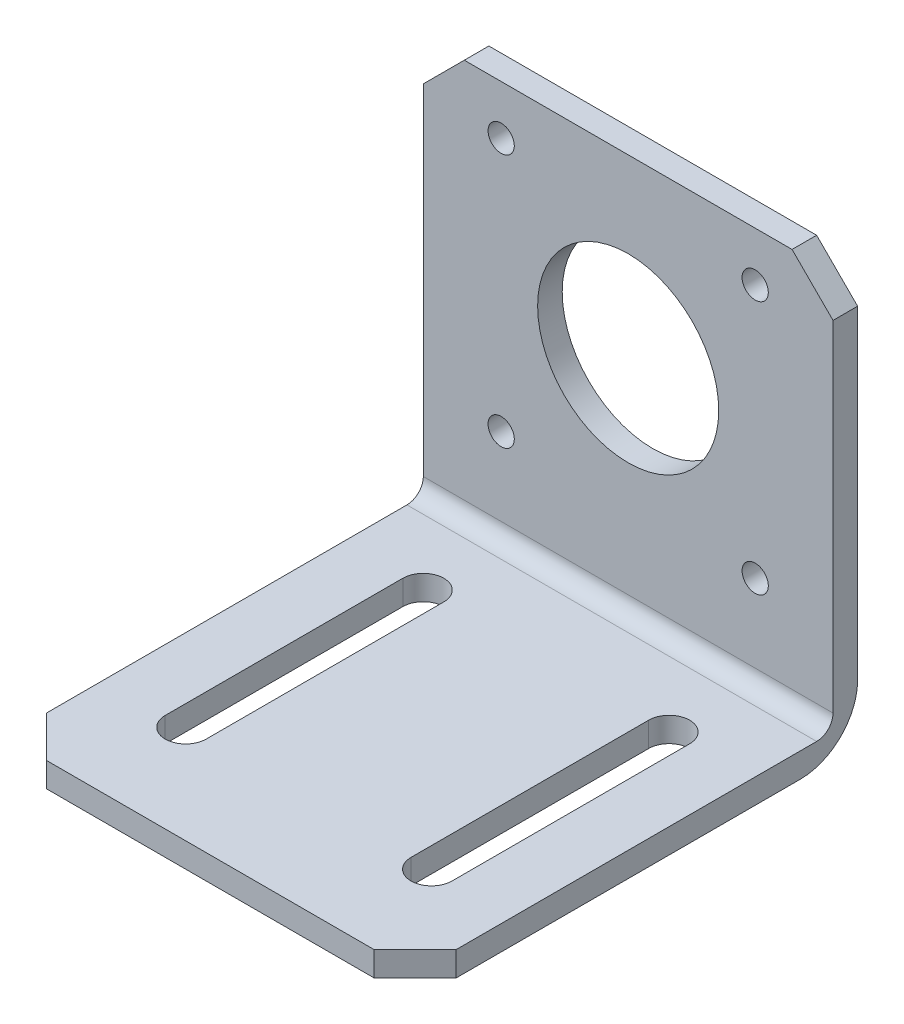
ISO-10303-21;
HEADER;
FILE_DESCRIPTION(('STEP AP214'),'2;1');
FILE_NAME('part.step','',(''),(''),'','','');
FILE_SCHEMA(('AUTOMOTIVE_DESIGN { 1 0 10303 214 1 1 1 1 }'));
ENDSEC;
DATA;
#1=APPLICATION_CONTEXT('core data for automotive mechanical design processes');
#2=APPLICATION_PROTOCOL_DEFINITION('international standard','automotive_design',2000,#1);
#3=PRODUCT_CONTEXT('',#1,'mechanical');
#4=PRODUCT('Part','Part','',(#3));
#5=PRODUCT_RELATED_PRODUCT_CATEGORY('part','',(#4));
#6=PRODUCT_DEFINITION_FORMATION('','',#4);
#7=PRODUCT_DEFINITION_CONTEXT('part definition',#1,'design');
#8=PRODUCT_DEFINITION('design','',#6,#7);
#9=PRODUCT_DEFINITION_SHAPE('','',#8);
#10=(LENGTH_UNIT() NAMED_UNIT(*) SI_UNIT(.MILLI.,.METRE.));
#11=(NAMED_UNIT(*) PLANE_ANGLE_UNIT() SI_UNIT($,.RADIAN.));
#12=(NAMED_UNIT(*) SI_UNIT($,.STERADIAN.) SOLID_ANGLE_UNIT());
#13=UNCERTAINTY_MEASURE_WITH_UNIT(LENGTH_MEASURE(1.E-05),#10,'distance_accuracy_value','');
#14=(GEOMETRIC_REPRESENTATION_CONTEXT(3) GLOBAL_UNCERTAINTY_ASSIGNED_CONTEXT((#13)) GLOBAL_UNIT_ASSIGNED_CONTEXT((#10,
#11,#12)) REPRESENTATION_CONTEXT('',''));
#15=CARTESIAN_POINT('',(0.,0.,0.));
#16=DIRECTION('',(0.,0.,1.));
#17=DIRECTION('',(1.,0.,0.));
#18=AXIS2_PLACEMENT_3D('',#15,#16,#17);
#19=CARTESIAN_POINT('',(0.,0.,3.));
#20=DIRECTION('',(0.,0.,-1.));
#21=DIRECTION('',(-1.,0.,0.));
#22=AXIS2_PLACEMENT_3D('',#19,#20,#21);
#23=PLANE('',#22);
#24=CARTESIAN_POINT('',(40.5,14.5,3.));
#25=DIRECTION('',(0.,0.,-1.));
#26=DIRECTION('',(-1.,0.,0.));
#27=AXIS2_PLACEMENT_3D('',#24,#25,#26);
#28=CIRCLE('',#27,1.6);
#29=CARTESIAN_POINT('',(38.9,14.5,3.));
#30=VERTEX_POINT('',#29);
#31=EDGE_CURVE('E272',#30,#30,#28,.T.);
#32=ORIENTED_EDGE('',*,*,#31,.T.);
#33=EDGE_LOOP('',(#32));
#34=FACE_BOUND('',#33,.T.);
#35=CARTESIAN_POINT('',(9.5,14.5,3.));
#36=DIRECTION('',(0.,0.,-1.));
#37=DIRECTION('',(-1.,0.,0.));
#38=AXIS2_PLACEMENT_3D('',#35,#36,#37);
#39=CIRCLE('',#38,1.6);
#40=CARTESIAN_POINT('',(7.9,14.5,3.));
#41=VERTEX_POINT('',#40);
#42=EDGE_CURVE('E269',#41,#41,#39,.T.);
#43=ORIENTED_EDGE('',*,*,#42,.T.);
#44=EDGE_LOOP('',(#43));
#45=FACE_BOUND('',#44,.T.);
#46=CARTESIAN_POINT('',(9.50000000000001,45.5,3.));
#47=DIRECTION('',(0.,0.,-1.));
#48=DIRECTION('',(-1.,0.,0.));
#49=AXIS2_PLACEMENT_3D('',#46,#47,#48);
#50=CIRCLE('',#49,1.6);
#51=CARTESIAN_POINT('',(7.90000000000001,45.5,3.));
#52=VERTEX_POINT('',#51);
#53=EDGE_CURVE('E266',#52,#52,#50,.T.);
#54=ORIENTED_EDGE('',*,*,#53,.T.);
#55=EDGE_LOOP('',(#54));
#56=FACE_BOUND('',#55,.T.);
#57=CARTESIAN_POINT('',(40.5,45.5,3.));
#58=DIRECTION('',(0.,0.,-1.));
#59=DIRECTION('',(-1.,0.,0.));
#60=AXIS2_PLACEMENT_3D('',#57,#58,#59);
#61=CIRCLE('',#60,1.6);
#62=CARTESIAN_POINT('',(38.9,45.5,3.));
#63=VERTEX_POINT('',#62);
#64=EDGE_CURVE('E263',#63,#63,#61,.T.);
#65=ORIENTED_EDGE('',*,*,#64,.T.);
#66=EDGE_LOOP('',(#65));
#67=FACE_BOUND('',#66,.T.);
#68=CARTESIAN_POINT('',(25.,30.,3.));
#69=DIRECTION('',(0.,0.,-1.));
#70=DIRECTION('',(-1.,0.,0.));
#71=AXIS2_PLACEMENT_3D('',#68,#69,#70);
#72=CIRCLE('',#71,11.05);
#73=CARTESIAN_POINT('',(13.95,30.,3.));
#74=VERTEX_POINT('',#73);
#75=EDGE_CURVE('E260',#74,#74,#72,.T.);
#76=ORIENTED_EDGE('',*,*,#75,.T.);
#77=EDGE_LOOP('',(#76));
#78=FACE_BOUND('',#77,.T.);
#79=DIRECTION('',(0.,-1.,0.));
#80=VECTOR('',#79,1.);
#81=CARTESIAN_POINT('',(0.,0.,3.));
#82=LINE('',#81,#80);
#83=CARTESIAN_POINT('',(0.,46.5,3.));
#84=VERTEX_POINT('',#83);
#85=CARTESIAN_POINT('',(0.,5.,3.));
#86=VERTEX_POINT('',#85);
#87=EDGE_CURVE('E287',#84,#86,#82,.T.);
#88=ORIENTED_EDGE('',*,*,#87,.T.);
#89=DIRECTION('',(-1.,0.,0.));
#90=VECTOR('',#89,1.);
#91=CARTESIAN_POINT('',(50.,5.,3.));
#92=LINE('',#91,#90);
#93=CARTESIAN_POINT('',(50.,5.,3.));
#94=VERTEX_POINT('',#93);
#95=EDGE_CURVE('E49',#86,#94,#92,.F.);
#96=ORIENTED_EDGE('',*,*,#95,.T.);
#97=DIRECTION('',(0.,1.,0.));
#98=VECTOR('',#97,1.);
#99=CARTESIAN_POINT('',(50.,0.,3.));
#100=LINE('',#99,#98);
#101=CARTESIAN_POINT('',(50.,46.5,3.));
#102=VERTEX_POINT('',#101);
#103=EDGE_CURVE('E289',#94,#102,#100,.T.);
#104=ORIENTED_EDGE('',*,*,#103,.T.);
#105=DIRECTION('',(0.707106781186549,-0.707106781186547,0.));
#106=VECTOR('',#105,1.);
#107=CARTESIAN_POINT('',(45.,51.5,3.));
#108=LINE('',#107,#106);
#109=CARTESIAN_POINT('',(45.,51.5,3.));
#110=VERTEX_POINT('',#109);
#111=EDGE_CURVE('E341',#102,#110,#108,.F.);
#112=ORIENTED_EDGE('',*,*,#111,.T.);
#113=DIRECTION('',(-1.,0.,0.));
#114=VECTOR('',#113,1.);
#115=CARTESIAN_POINT('',(0.,51.5,3.));
#116=LINE('',#115,#114);
#117=CARTESIAN_POINT('',(5.,51.5,3.));
#118=VERTEX_POINT('',#117);
#119=EDGE_CURVE('E292',#110,#118,#116,.T.);
#120=ORIENTED_EDGE('',*,*,#119,.T.);
#121=DIRECTION('',(0.707106781186547,0.707106781186549,0.));
#122=VECTOR('',#121,1.);
#123=CARTESIAN_POINT('',(0.,46.5,3.));
#124=LINE('',#123,#122);
#125=EDGE_CURVE('E343',#118,#84,#124,.F.);
#126=ORIENTED_EDGE('',*,*,#125,.T.);
#127=EDGE_LOOP('',(#88,#96,#104,#112,#120,#126));
#128=FACE_BOUND('',#127,.T.);
#129=ADVANCED_FACE('F34',(#34,#45,#56,#67,#78,#128),#23,.F.);
#130=CARTESIAN_POINT('',(0.,0.,3.));
#131=DIRECTION('',(1.,0.,0.));
#132=DIRECTION('',(0.,1.,0.));
#133=AXIS2_PLACEMENT_3D('',#130,#131,#132);
#134=PLANE('',#133);
#135=DIRECTION('',(0.,-1.,0.));
#136=VECTOR('',#135,1.);
#137=CARTESIAN_POINT('',(0.,0.,0.));
#138=LINE('',#137,#136);
#139=CARTESIAN_POINT('',(0.,46.5,0.));
#140=VERTEX_POINT('',#139);
#141=CARTESIAN_POINT('',(0.,7.,0.));
#142=VERTEX_POINT('',#141);
#143=EDGE_CURVE('E286',#140,#142,#138,.T.);
#144=ORIENTED_EDGE('',*,*,#143,.T.);
#145=CARTESIAN_POINT('',(0.,7.,7.));
#146=DIRECTION('',(1.,0.,0.));
#147=DIRECTION('',(0.,1.,0.));
#148=AXIS2_PLACEMENT_3D('',#145,#146,#147);
#149=CIRCLE('',#148,7.);
#150=CARTESIAN_POINT('',(0.,0.,7.));
#151=VERTEX_POINT('',#150);
#152=EDGE_CURVE('E352',#142,#151,#149,.F.);
#153=ORIENTED_EDGE('',*,*,#152,.T.);
#154=DIRECTION('',(0.,0.,-1.));
#155=VECTOR('',#154,1.);
#156=CARTESIAN_POINT('',(0.,0.,3.));
#157=LINE('',#156,#155);
#158=CARTESIAN_POINT('',(0.,0.,49.));
#159=VERTEX_POINT('',#158);
#160=EDGE_CURVE('E304',#159,#151,#157,.T.);
#161=ORIENTED_EDGE('',*,*,#160,.F.);
#162=DIRECTION('',(0.,1.,0.));
#163=VECTOR('',#162,1.);
#164=CARTESIAN_POINT('',(0.,0.,49.));
#165=LINE('',#164,#163);
#166=CARTESIAN_POINT('',(0.,3.,49.));
#167=VERTEX_POINT('',#166);
#168=EDGE_CURVE('E320',#159,#167,#165,.T.);
#169=ORIENTED_EDGE('',*,*,#168,.T.);
#170=DIRECTION('',(0.,0.,-1.));
#171=VECTOR('',#170,1.);
#172=CARTESIAN_POINT('',(0.,3.,54.));
#173=LINE('',#172,#171);
#174=CARTESIAN_POINT('',(0.,3.,5.));
#175=VERTEX_POINT('',#174);
#176=EDGE_CURVE('E281',#167,#175,#173,.T.);
#177=ORIENTED_EDGE('',*,*,#176,.T.);
#178=CARTESIAN_POINT('',(0.,5.,5.));
#179=DIRECTION('',(1.,0.,0.));
#180=DIRECTION('',(0.,1.,0.));
#181=AXIS2_PLACEMENT_3D('',#178,#179,#180);
#182=CIRCLE('',#181,2.);
#183=EDGE_CURVE('E42',#175,#86,#182,.T.);
#184=ORIENTED_EDGE('',*,*,#183,.T.);
#185=ORIENTED_EDGE('',*,*,#87,.F.);
#186=DIRECTION('',(0.,0.,-1.));
#187=VECTOR('',#186,1.);
#188=CARTESIAN_POINT('',(0.,46.5,3.));
#189=LINE('',#188,#187);
#190=EDGE_CURVE('E317',#84,#140,#189,.T.);
#191=ORIENTED_EDGE('',*,*,#190,.T.);
#192=EDGE_LOOP('',(#144,#153,#161,#169,#177,#184,#185,#191));
#193=FACE_BOUND('',#192,.T.);
#194=ADVANCED_FACE('F365',(#193),#134,.F.);
#195=CARTESIAN_POINT('',(0.,0.,3.));
#196=DIRECTION('',(0.,1.,0.));
#197=DIRECTION('',(0.,0.,1.));
#198=AXIS2_PLACEMENT_3D('',#195,#196,#197);
#199=PLANE('',#198);
#200=DIRECTION('',(0.,0.,-1.));
#201=VECTOR('',#200,1.);
#202=CARTESIAN_POINT('',(12.5,0.,13.));
#203=LINE('',#202,#201);
#204=CARTESIAN_POINT('',(12.5,0.,42.));
#205=VERTEX_POINT('',#204);
#206=CARTESIAN_POINT('',(12.5,0.,13.));
#207=VERTEX_POINT('',#206);
#208=EDGE_CURVE('E182',#205,#207,#203,.T.);
#209=ORIENTED_EDGE('',*,*,#208,.T.);
#210=CARTESIAN_POINT('',(10.,0.,13.));
#211=DIRECTION('',(0.,1.,0.));
#212=DIRECTION('',(0.,0.,1.));
#213=AXIS2_PLACEMENT_3D('',#210,#211,#212);
#214=CIRCLE('',#213,2.5);
#215=CARTESIAN_POINT('',(7.5,0.,13.));
#216=VERTEX_POINT('',#215);
#217=EDGE_CURVE('E174',#207,#216,#214,.T.);
#218=ORIENTED_EDGE('',*,*,#217,.T.);
#219=DIRECTION('',(0.,0.,1.));
#220=VECTOR('',#219,1.);
#221=CARTESIAN_POINT('',(7.5,0.,13.));
#222=LINE('',#221,#220);
#223=CARTESIAN_POINT('',(7.5,0.,42.));
#224=VERTEX_POINT('',#223);
#225=EDGE_CURVE('E186',#216,#224,#222,.T.);
#226=ORIENTED_EDGE('',*,*,#225,.T.);
#227=CARTESIAN_POINT('',(10.,0.,42.));
#228=DIRECTION('',(0.,1.,0.));
#229=DIRECTION('',(0.,0.,1.));
#230=AXIS2_PLACEMENT_3D('',#227,#228,#229);
#231=CIRCLE('',#230,2.5);
#232=EDGE_CURVE('E190',#224,#205,#231,.T.);
#233=ORIENTED_EDGE('',*,*,#232,.T.);
#234=EDGE_LOOP('',(#209,#218,#226,#233));
#235=FACE_BOUND('',#234,.T.);
#236=DIRECTION('',(0.,0.,1.));
#237=VECTOR('',#236,1.);
#238=CARTESIAN_POINT('',(37.5,0.,42.));
#239=LINE('',#238,#237);
#240=CARTESIAN_POINT('',(37.5,0.,13.));
#241=VERTEX_POINT('',#240);
#242=CARTESIAN_POINT('',(37.5,0.,42.));
#243=VERTEX_POINT('',#242);
#244=EDGE_CURVE('E225',#241,#243,#239,.T.);
#245=ORIENTED_EDGE('',*,*,#244,.T.);
#246=CARTESIAN_POINT('',(40.,0.,42.));
#247=DIRECTION('',(0.,1.,0.));
#248=DIRECTION('',(0.,0.,1.));
#249=AXIS2_PLACEMENT_3D('',#246,#247,#248);
#250=CIRCLE('',#249,2.5);
#251=CARTESIAN_POINT('',(42.5,0.,42.));
#252=VERTEX_POINT('',#251);
#253=EDGE_CURVE('E215',#243,#252,#250,.T.);
#254=ORIENTED_EDGE('',*,*,#253,.T.);
#255=DIRECTION('',(0.,0.,-1.));
#256=VECTOR('',#255,1.);
#257=CARTESIAN_POINT('',(42.5,0.,42.));
#258=LINE('',#257,#256);
#259=CARTESIAN_POINT('',(42.5,0.,13.));
#260=VERTEX_POINT('',#259);
#261=EDGE_CURVE('E218',#252,#260,#258,.T.);
#262=ORIENTED_EDGE('',*,*,#261,.T.);
#263=CARTESIAN_POINT('',(40.,0.,13.));
#264=DIRECTION('',(0.,1.,0.));
#265=DIRECTION('',(0.,0.,1.));
#266=AXIS2_PLACEMENT_3D('',#263,#264,#265);
#267=CIRCLE('',#266,2.5);
#268=EDGE_CURVE('E222',#260,#241,#267,.T.);
#269=ORIENTED_EDGE('',*,*,#268,.T.);
#270=EDGE_LOOP('',(#245,#254,#262,#269));
#271=FACE_BOUND('',#270,.T.);
#272=ORIENTED_EDGE('',*,*,#160,.T.);
#273=DIRECTION('',(1.,0.,0.));
#274=VECTOR('',#273,1.);
#275=CARTESIAN_POINT('',(50.,0.,7.));
#276=LINE('',#275,#274);
#277=CARTESIAN_POINT('',(50.,0.,7.));
#278=VERTEX_POINT('',#277);
#279=EDGE_CURVE('E345',#151,#278,#276,.T.);
#280=ORIENTED_EDGE('',*,*,#279,.T.);
#281=DIRECTION('',(0.,0.,-1.));
#282=VECTOR('',#281,1.);
#283=CARTESIAN_POINT('',(50.,0.,3.));
#284=LINE('',#283,#282);
#285=CARTESIAN_POINT('',(50.,0.,49.));
#286=VERTEX_POINT('',#285);
#287=EDGE_CURVE('E295',#286,#278,#284,.T.);
#288=ORIENTED_EDGE('',*,*,#287,.F.);
#289=DIRECTION('',(0.707106781186548,0.,-0.707106781186548));
#290=VECTOR('',#289,1.);
#291=CARTESIAN_POINT('',(45.,0.,54.));
#292=LINE('',#291,#290);
#293=CARTESIAN_POINT('',(45.,0.,54.));
#294=VERTEX_POINT('',#293);
#295=EDGE_CURVE('E313',#286,#294,#292,.F.);
#296=ORIENTED_EDGE('',*,*,#295,.T.);
#297=DIRECTION('',(1.,0.,0.));
#298=VECTOR('',#297,1.);
#299=CARTESIAN_POINT('',(0.,0.,54.));
#300=LINE('',#299,#298);
#301=CARTESIAN_POINT('',(5.00000000000002,0.,54.));
#302=VERTEX_POINT('',#301);
#303=EDGE_CURVE('E275',#302,#294,#300,.T.);
#304=ORIENTED_EDGE('',*,*,#303,.F.);
#305=DIRECTION('',(0.707106781186548,0.,0.707106781186548));
#306=VECTOR('',#305,1.);
#307=CARTESIAN_POINT('',(5.00000000000002,0.,54.));
#308=LINE('',#307,#306);
#309=EDGE_CURVE('E315',#302,#159,#308,.F.);
#310=ORIENTED_EDGE('',*,*,#309,.T.);
#311=EDGE_LOOP('',(#272,#280,#288,#296,#304,#310));
#312=FACE_BOUND('',#311,.T.);
#313=ADVANCED_FACE('F192',(#235,#271,#312),#199,.F.);
#314=CARTESIAN_POINT('',(50.,0.,3.));
#315=DIRECTION('',(-1.,0.,0.));
#316=DIRECTION('',(0.,-1.,0.));
#317=AXIS2_PLACEMENT_3D('',#314,#315,#316);
#318=PLANE('',#317);
#319=ORIENTED_EDGE('',*,*,#287,.T.);
#320=CARTESIAN_POINT('',(50.,7.,7.));
#321=DIRECTION('',(-1.,0.,0.));
#322=DIRECTION('',(0.,-1.,0.));
#323=AXIS2_PLACEMENT_3D('',#320,#321,#322);
#324=CIRCLE('',#323,7.);
#325=CARTESIAN_POINT('',(50.,7.,0.));
#326=VERTEX_POINT('',#325);
#327=EDGE_CURVE('E348',#278,#326,#324,.F.);
#328=ORIENTED_EDGE('',*,*,#327,.T.);
#329=DIRECTION('',(0.,1.,0.));
#330=VECTOR('',#329,1.);
#331=CARTESIAN_POINT('',(50.,0.,0.));
#332=LINE('',#331,#330);
#333=CARTESIAN_POINT('',(50.,46.5,0.));
#334=VERTEX_POINT('',#333);
#335=EDGE_CURVE('E298',#326,#334,#332,.T.);
#336=ORIENTED_EDGE('',*,*,#335,.T.);
#337=DIRECTION('',(0.,0.,1.));
#338=VECTOR('',#337,1.);
#339=CARTESIAN_POINT('',(50.,46.5,3.));
#340=LINE('',#339,#338);
#341=EDGE_CURVE('E326',#334,#102,#340,.T.);
#342=ORIENTED_EDGE('',*,*,#341,.T.);
#343=ORIENTED_EDGE('',*,*,#103,.F.);
#344=CARTESIAN_POINT('',(50.,5.,5.));
#345=DIRECTION('',(-1.,0.,0.));
#346=DIRECTION('',(0.,-1.,0.));
#347=AXIS2_PLACEMENT_3D('',#344,#345,#346);
#348=CIRCLE('',#347,2.);
#349=CARTESIAN_POINT('',(50.,3.,5.));
#350=VERTEX_POINT('',#349);
#351=EDGE_CURVE('E11',#94,#350,#348,.T.);
#352=ORIENTED_EDGE('',*,*,#351,.T.);
#353=DIRECTION('',(0.,0.,-1.));
#354=VECTOR('',#353,1.);
#355=CARTESIAN_POINT('',(50.,3.,54.));
#356=LINE('',#355,#354);
#357=CARTESIAN_POINT('',(50.,3.,49.));
#358=VERTEX_POINT('',#357);
#359=EDGE_CURVE('E283',#358,#350,#356,.T.);
#360=ORIENTED_EDGE('',*,*,#359,.F.);
#361=DIRECTION('',(0.,-1.,0.));
#362=VECTOR('',#361,1.);
#363=CARTESIAN_POINT('',(50.,0.,49.));
#364=LINE('',#363,#362);
#365=EDGE_CURVE('E329',#358,#286,#364,.T.);
#366=ORIENTED_EDGE('',*,*,#365,.T.);
#367=EDGE_LOOP('',(#319,#328,#336,#342,#343,#352,#360,#366));
#368=FACE_BOUND('',#367,.T.);
#369=ADVANCED_FACE('F381',(#368),#318,.F.);
#370=CARTESIAN_POINT('',(0.,51.5,3.));
#371=DIRECTION('',(0.,-1.,0.));
#372=DIRECTION('',(0.,0.,-1.));
#373=AXIS2_PLACEMENT_3D('',#370,#371,#372);
#374=PLANE('',#373);
#375=DIRECTION('',(-1.,0.,0.));
#376=VECTOR('',#375,1.);
#377=CARTESIAN_POINT('',(0.,51.5,0.));
#378=LINE('',#377,#376);
#379=CARTESIAN_POINT('',(45.,51.5,0.));
#380=VERTEX_POINT('',#379);
#381=CARTESIAN_POINT('',(5.,51.5,0.));
#382=VERTEX_POINT('',#381);
#383=EDGE_CURVE('E290',#380,#382,#378,.T.);
#384=ORIENTED_EDGE('',*,*,#383,.T.);
#385=DIRECTION('',(0.,0.,1.));
#386=VECTOR('',#385,1.);
#387=CARTESIAN_POINT('',(5.,51.5,3.));
#388=LINE('',#387,#386);
#389=EDGE_CURVE('E339',#382,#118,#388,.T.);
#390=ORIENTED_EDGE('',*,*,#389,.T.);
#391=ORIENTED_EDGE('',*,*,#119,.F.);
#392=DIRECTION('',(0.,0.,-1.));
#393=VECTOR('',#392,1.);
#394=CARTESIAN_POINT('',(45.,51.5,3.));
#395=LINE('',#394,#393);
#396=EDGE_CURVE('E336',#110,#380,#395,.T.);
#397=ORIENTED_EDGE('',*,*,#396,.T.);
#398=EDGE_LOOP('',(#384,#390,#391,#397));
#399=FACE_BOUND('',#398,.T.);
#400=ADVANCED_FACE('F404',(#399),#374,.F.);
#401=CARTESIAN_POINT('',(0.,0.,0.));
#402=DIRECTION('',(0.,0.,-1.));
#403=DIRECTION('',(-1.,0.,0.));
#404=AXIS2_PLACEMENT_3D('',#401,#402,#403);
#405=PLANE('',#404);
#406=CARTESIAN_POINT('',(40.5,14.5,0.));
#407=DIRECTION('',(0.,0.,-1.));
#408=DIRECTION('',(-1.,0.,0.));
#409=AXIS2_PLACEMENT_3D('',#406,#407,#408);
#410=CIRCLE('',#409,1.6);
#411=CARTESIAN_POINT('',(38.9,14.5,0.));
#412=VERTEX_POINT('',#411);
#413=EDGE_CURVE('E211',#412,#412,#410,.T.);
#414=ORIENTED_EDGE('',*,*,#413,.F.);
#415=EDGE_LOOP('',(#414));
#416=FACE_BOUND('',#415,.T.);
#417=CARTESIAN_POINT('',(9.5,14.5,0.));
#418=DIRECTION('',(0.,0.,-1.));
#419=DIRECTION('',(-1.,0.,0.));
#420=AXIS2_PLACEMENT_3D('',#417,#418,#419);
#421=CIRCLE('',#420,1.6);
#422=CARTESIAN_POINT('',(7.9,14.5,0.));
#423=VERTEX_POINT('',#422);
#424=EDGE_CURVE('E253',#423,#423,#421,.T.);
#425=ORIENTED_EDGE('',*,*,#424,.F.);
#426=EDGE_LOOP('',(#425));
#427=FACE_BOUND('',#426,.T.);
#428=CARTESIAN_POINT('',(9.50000000000001,45.5,0.));
#429=DIRECTION('',(0.,0.,-1.));
#430=DIRECTION('',(-1.,0.,0.));
#431=AXIS2_PLACEMENT_3D('',#428,#429,#430);
#432=CIRCLE('',#431,1.6);
#433=CARTESIAN_POINT('',(7.90000000000001,45.5,0.));
#434=VERTEX_POINT('',#433);
#435=EDGE_CURVE('E250',#434,#434,#432,.T.);
#436=ORIENTED_EDGE('',*,*,#435,.F.);
#437=EDGE_LOOP('',(#436));
#438=FACE_BOUND('',#437,.T.);
#439=CARTESIAN_POINT('',(40.5,45.5,0.));
#440=DIRECTION('',(0.,0.,-1.));
#441=DIRECTION('',(-1.,0.,0.));
#442=AXIS2_PLACEMENT_3D('',#439,#440,#441);
#443=CIRCLE('',#442,1.6);
#444=CARTESIAN_POINT('',(38.9,45.5,0.));
#445=VERTEX_POINT('',#444);
#446=EDGE_CURVE('E246',#445,#445,#443,.T.);
#447=ORIENTED_EDGE('',*,*,#446,.F.);
#448=EDGE_LOOP('',(#447));
#449=FACE_BOUND('',#448,.T.);
#450=CARTESIAN_POINT('',(25.,30.,0.));
#451=DIRECTION('',(0.,0.,-1.));
#452=DIRECTION('',(-1.,0.,0.));
#453=AXIS2_PLACEMENT_3D('',#450,#451,#452);
#454=CIRCLE('',#453,11.05);
#455=CARTESIAN_POINT('',(13.95,30.,0.));
#456=VERTEX_POINT('',#455);
#457=EDGE_CURVE('E249',#456,#456,#454,.T.);
#458=ORIENTED_EDGE('',*,*,#457,.F.);
#459=EDGE_LOOP('',(#458));
#460=FACE_BOUND('',#459,.T.);
#461=ORIENTED_EDGE('',*,*,#335,.F.);
#462=DIRECTION('',(1.,0.,0.));
#463=VECTOR('',#462,1.);
#464=CARTESIAN_POINT('',(0.,7.,0.));
#465=LINE('',#464,#463);
#466=EDGE_CURVE('E350',#326,#142,#465,.F.);
#467=ORIENTED_EDGE('',*,*,#466,.T.);
#468=ORIENTED_EDGE('',*,*,#143,.F.);
#469=DIRECTION('',(-0.707106781186547,-0.707106781186549,0.));
#470=VECTOR('',#469,1.);
#471=CARTESIAN_POINT('',(-23.25,23.2499999999999,0.));
#472=LINE('',#471,#470);
#473=EDGE_CURVE('E334',#140,#382,#472,.F.);
#474=ORIENTED_EDGE('',*,*,#473,.T.);
#475=ORIENTED_EDGE('',*,*,#383,.F.);
#476=DIRECTION('',(-0.707106781186549,0.707106781186547,0.));
#477=VECTOR('',#476,1.);
#478=CARTESIAN_POINT('',(48.2499999999999,48.25,0.));
#479=LINE('',#478,#477);
#480=EDGE_CURVE('E331',#380,#334,#479,.F.);
#481=ORIENTED_EDGE('',*,*,#480,.T.);
#482=EDGE_LOOP('',(#461,#467,#468,#474,#475,#481));
#483=FACE_BOUND('',#482,.T.);
#484=ADVANCED_FACE('F401',(#416,#427,#438,#449,#460,#483),#405,.T.);
#485=CARTESIAN_POINT('',(0.,3.,54.));
#486=DIRECTION('',(0.,-1.,0.));
#487=DIRECTION('',(0.,0.,-1.));
#488=AXIS2_PLACEMENT_3D('',#485,#486,#487);
#489=PLANE('',#488);
#490=DIRECTION('',(0.,0.,1.));
#491=VECTOR('',#490,1.);
#492=CARTESIAN_POINT('',(7.5,3.,13.));
#493=LINE('',#492,#491);
#494=CARTESIAN_POINT('',(7.5,3.,13.));
#495=VERTEX_POINT('',#494);
#496=CARTESIAN_POINT('',(7.5,3.,42.));
#497=VERTEX_POINT('',#496);
#498=EDGE_CURVE('E204',#495,#497,#493,.T.);
#499=ORIENTED_EDGE('',*,*,#498,.F.);
#500=CARTESIAN_POINT('',(10.,3.,13.));
#501=DIRECTION('',(0.,1.,0.));
#502=DIRECTION('',(0.,0.,1.));
#503=AXIS2_PLACEMENT_3D('',#500,#501,#502);
#504=CIRCLE('',#503,2.5);
#505=CARTESIAN_POINT('',(12.5,3.,13.));
#506=VERTEX_POINT('',#505);
#507=EDGE_CURVE('E177',#506,#495,#504,.T.);
#508=ORIENTED_EDGE('',*,*,#507,.F.);
#509=DIRECTION('',(0.,0.,-1.));
#510=VECTOR('',#509,1.);
#511=CARTESIAN_POINT('',(12.5,3.,13.));
#512=LINE('',#511,#510);
#513=CARTESIAN_POINT('',(12.5,3.,42.));
#514=VERTEX_POINT('',#513);
#515=EDGE_CURVE('E195',#514,#506,#512,.T.);
#516=ORIENTED_EDGE('',*,*,#515,.F.);
#517=CARTESIAN_POINT('',(10.,3.,42.));
#518=DIRECTION('',(0.,1.,0.));
#519=DIRECTION('',(0.,0.,1.));
#520=AXIS2_PLACEMENT_3D('',#517,#518,#519);
#521=CIRCLE('',#520,2.5);
#522=EDGE_CURVE('E198',#497,#514,#521,.T.);
#523=ORIENTED_EDGE('',*,*,#522,.F.);
#524=EDGE_LOOP('',(#499,#508,#516,#523));
#525=FACE_BOUND('',#524,.T.);
#526=DIRECTION('',(0.,0.,-1.));
#527=VECTOR('',#526,1.);
#528=CARTESIAN_POINT('',(42.5,3.,42.));
#529=LINE('',#528,#527);
#530=CARTESIAN_POINT('',(42.5,3.,42.));
#531=VERTEX_POINT('',#530);
#532=CARTESIAN_POINT('',(42.5,3.,13.));
#533=VERTEX_POINT('',#532);
#534=EDGE_CURVE('E231',#531,#533,#529,.T.);
#535=ORIENTED_EDGE('',*,*,#534,.F.);
#536=CARTESIAN_POINT('',(40.,3.,42.));
#537=DIRECTION('',(0.,1.,0.));
#538=DIRECTION('',(0.,0.,1.));
#539=AXIS2_PLACEMENT_3D('',#536,#537,#538);
#540=CIRCLE('',#539,2.5);
#541=CARTESIAN_POINT('',(37.5,3.,42.));
#542=VERTEX_POINT('',#541);
#543=EDGE_CURVE('E229',#542,#531,#540,.T.);
#544=ORIENTED_EDGE('',*,*,#543,.F.);
#545=DIRECTION('',(0.,0.,1.));
#546=VECTOR('',#545,1.);
#547=CARTESIAN_POINT('',(37.5,3.,42.));
#548=LINE('',#547,#546);
#549=CARTESIAN_POINT('',(37.5,3.,13.));
#550=VERTEX_POINT('',#549);
#551=EDGE_CURVE('E219',#550,#542,#548,.T.);
#552=ORIENTED_EDGE('',*,*,#551,.F.);
#553=CARTESIAN_POINT('',(40.,3.,13.));
#554=DIRECTION('',(0.,1.,0.));
#555=DIRECTION('',(0.,0.,1.));
#556=AXIS2_PLACEMENT_3D('',#553,#554,#555);
#557=CIRCLE('',#556,2.5);
#558=EDGE_CURVE('E234',#533,#550,#557,.T.);
#559=ORIENTED_EDGE('',*,*,#558,.F.);
#560=EDGE_LOOP('',(#535,#544,#552,#559));
#561=FACE_BOUND('',#560,.T.);
#562=ORIENTED_EDGE('',*,*,#359,.T.);
#563=DIRECTION('',(-1.,0.,0.));
#564=VECTOR('',#563,1.);
#565=CARTESIAN_POINT('',(0.,3.,5.));
#566=LINE('',#565,#564);
#567=EDGE_CURVE('E354',#350,#175,#566,.T.);
#568=ORIENTED_EDGE('',*,*,#567,.T.);
#569=ORIENTED_EDGE('',*,*,#176,.F.);
#570=DIRECTION('',(-0.707106781186548,0.,-0.707106781186548));
#571=VECTOR('',#570,1.);
#572=CARTESIAN_POINT('',(5.00000000000002,3.,54.));
#573=LINE('',#572,#571);
#574=CARTESIAN_POINT('',(5.00000000000002,3.,54.));
#575=VERTEX_POINT('',#574);
#576=EDGE_CURVE('E324',#167,#575,#573,.F.);
#577=ORIENTED_EDGE('',*,*,#576,.T.);
#578=DIRECTION('',(-1.,0.,0.));
#579=VECTOR('',#578,1.);
#580=CARTESIAN_POINT('',(0.,3.,54.));
#581=LINE('',#580,#579);
#582=CARTESIAN_POINT('',(45.,3.,54.));
#583=VERTEX_POINT('',#582);
#584=EDGE_CURVE('E278',#583,#575,#581,.T.);
#585=ORIENTED_EDGE('',*,*,#584,.F.);
#586=DIRECTION('',(-0.707106781186548,0.,0.707106781186548));
#587=VECTOR('',#586,1.);
#588=CARTESIAN_POINT('',(45.,3.,54.));
#589=LINE('',#588,#587);
#590=EDGE_CURVE('E322',#583,#358,#589,.F.);
#591=ORIENTED_EDGE('',*,*,#590,.T.);
#592=EDGE_LOOP('',(#562,#568,#569,#577,#585,#591));
#593=FACE_BOUND('',#592,.T.);
#594=ADVANCED_FACE('F360',(#525,#561,#593),#489,.F.);
#595=CARTESIAN_POINT('',(0.,0.,54.));
#596=DIRECTION('',(0.,0.,-1.));
#597=DIRECTION('',(-1.,0.,0.));
#598=AXIS2_PLACEMENT_3D('',#595,#596,#597);
#599=PLANE('',#598);
#600=ORIENTED_EDGE('',*,*,#584,.T.);
#601=DIRECTION('',(0.,-1.,0.));
#602=VECTOR('',#601,1.);
#603=CARTESIAN_POINT('',(5.00000000000002,0.,54.));
#604=LINE('',#603,#602);
#605=EDGE_CURVE('E310',#575,#302,#604,.T.);
#606=ORIENTED_EDGE('',*,*,#605,.T.);
#607=ORIENTED_EDGE('',*,*,#303,.T.);
#608=DIRECTION('',(0.,1.,0.));
#609=VECTOR('',#608,1.);
#610=CARTESIAN_POINT('',(45.,0.,54.));
#611=LINE('',#610,#609);
#612=EDGE_CURVE('E307',#294,#583,#611,.T.);
#613=ORIENTED_EDGE('',*,*,#612,.T.);
#614=EDGE_LOOP('',(#600,#606,#607,#613));
#615=FACE_BOUND('',#614,.T.);
#616=ADVANCED_FACE('F373',(#615),#599,.F.);
#617=CARTESIAN_POINT('',(25.,30.,54.));
#618=DIRECTION('',(0.,0.,-1.));
#619=DIRECTION('',(-1.,0.,0.));
#620=AXIS2_PLACEMENT_3D('',#617,#618,#619);
#621=CYLINDRICAL_SURFACE('',#620,11.05);
#622=ORIENTED_EDGE('',*,*,#457,.T.);
#623=EDGE_LOOP('',(#622));
#624=FACE_BOUND('',#623,.T.);
#625=ORIENTED_EDGE('',*,*,#75,.F.);
#626=EDGE_LOOP('',(#625));
#627=FACE_BOUND('',#626,.T.);
#628=ADVANCED_FACE('F491',(#624,#627),#621,.F.);
#629=CARTESIAN_POINT('',(40.5,45.5,54.));
#630=DIRECTION('',(0.,0.,-1.));
#631=DIRECTION('',(-1.,0.,0.));
#632=AXIS2_PLACEMENT_3D('',#629,#630,#631);
#633=CYLINDRICAL_SURFACE('',#632,1.6);
#634=ORIENTED_EDGE('',*,*,#446,.T.);
#635=EDGE_LOOP('',(#634));
#636=FACE_BOUND('',#635,.T.);
#637=ORIENTED_EDGE('',*,*,#64,.F.);
#638=EDGE_LOOP('',(#637));
#639=FACE_BOUND('',#638,.T.);
#640=ADVANCED_FACE('F498',(#636,#639),#633,.F.);
#641=CARTESIAN_POINT('',(9.50000000000001,45.5,54.));
#642=DIRECTION('',(0.,0.,-1.));
#643=DIRECTION('',(-1.,0.,0.));
#644=AXIS2_PLACEMENT_3D('',#641,#642,#643);
#645=CYLINDRICAL_SURFACE('',#644,1.6);
#646=ORIENTED_EDGE('',*,*,#435,.T.);
#647=EDGE_LOOP('',(#646));
#648=FACE_BOUND('',#647,.T.);
#649=ORIENTED_EDGE('',*,*,#53,.F.);
#650=EDGE_LOOP('',(#649));
#651=FACE_BOUND('',#650,.T.);
#652=ADVANCED_FACE('F506',(#648,#651),#645,.F.);
#653=CARTESIAN_POINT('',(9.5,14.5,54.));
#654=DIRECTION('',(0.,0.,-1.));
#655=DIRECTION('',(-1.,0.,0.));
#656=AXIS2_PLACEMENT_3D('',#653,#654,#655);
#657=CYLINDRICAL_SURFACE('',#656,1.6);
#658=ORIENTED_EDGE('',*,*,#424,.T.);
#659=EDGE_LOOP('',(#658));
#660=FACE_BOUND('',#659,.T.);
#661=ORIENTED_EDGE('',*,*,#42,.F.);
#662=EDGE_LOOP('',(#661));
#663=FACE_BOUND('',#662,.T.);
#664=ADVANCED_FACE('F514',(#660,#663),#657,.F.);
#665=CARTESIAN_POINT('',(40.5,14.5,54.));
#666=DIRECTION('',(0.,0.,-1.));
#667=DIRECTION('',(-1.,0.,0.));
#668=AXIS2_PLACEMENT_3D('',#665,#666,#667);
#669=CYLINDRICAL_SURFACE('',#668,1.6);
#670=ORIENTED_EDGE('',*,*,#413,.T.);
#671=EDGE_LOOP('',(#670));
#672=FACE_BOUND('',#671,.T.);
#673=ORIENTED_EDGE('',*,*,#31,.F.);
#674=EDGE_LOOP('',(#673));
#675=FACE_BOUND('',#674,.T.);
#676=ADVANCED_FACE('F522',(#672,#675),#669,.F.);
#677=CARTESIAN_POINT('',(40.,0.,42.));
#678=DIRECTION('',(0.,1.,0.));
#679=DIRECTION('',(0.,0.,1.));
#680=AXIS2_PLACEMENT_3D('',#677,#678,#679);
#681=CYLINDRICAL_SURFACE('',#680,2.5);
#682=ORIENTED_EDGE('',*,*,#543,.T.);
#683=DIRECTION('',(0.,1.,0.));
#684=VECTOR('',#683,1.);
#685=CARTESIAN_POINT('',(42.5,0.,42.));
#686=LINE('',#685,#684);
#687=EDGE_CURVE('E228',#252,#531,#686,.T.);
#688=ORIENTED_EDGE('',*,*,#687,.F.);
#689=ORIENTED_EDGE('',*,*,#253,.F.);
#690=DIRECTION('',(0.,1.,0.));
#691=VECTOR('',#690,1.);
#692=CARTESIAN_POINT('',(37.5,0.,42.));
#693=LINE('',#692,#691);
#694=EDGE_CURVE('E205',#243,#542,#693,.T.);
#695=ORIENTED_EDGE('',*,*,#694,.T.);
#696=EDGE_LOOP('',(#682,#688,#689,#695));
#697=FACE_BOUND('',#696,.T.);
#698=ADVANCED_FACE('F530',(#697),#681,.F.);
#699=CARTESIAN_POINT('',(37.5,0.,42.));
#700=DIRECTION('',(-1.,0.,0.));
#701=DIRECTION('',(0.,0.,1.));
#702=AXIS2_PLACEMENT_3D('',#699,#700,#701);
#703=PLANE('',#702);
#704=ORIENTED_EDGE('',*,*,#551,.T.);
#705=ORIENTED_EDGE('',*,*,#694,.F.);
#706=ORIENTED_EDGE('',*,*,#244,.F.);
#707=DIRECTION('',(0.,1.,0.));
#708=VECTOR('',#707,1.);
#709=CARTESIAN_POINT('',(37.5,0.,13.));
#710=LINE('',#709,#708);
#711=EDGE_CURVE('E240',#241,#550,#710,.T.);
#712=ORIENTED_EDGE('',*,*,#711,.T.);
#713=EDGE_LOOP('',(#704,#705,#706,#712));
#714=FACE_BOUND('',#713,.T.);
#715=ADVANCED_FACE('F538',(#714),#703,.F.);
#716=CARTESIAN_POINT('',(40.,0.,13.));
#717=DIRECTION('',(0.,1.,0.));
#718=DIRECTION('',(0.,0.,1.));
#719=AXIS2_PLACEMENT_3D('',#716,#717,#718);
#720=CYLINDRICAL_SURFACE('',#719,2.5);
#721=ORIENTED_EDGE('',*,*,#558,.T.);
#722=ORIENTED_EDGE('',*,*,#711,.F.);
#723=ORIENTED_EDGE('',*,*,#268,.F.);
#724=DIRECTION('',(0.,1.,0.));
#725=VECTOR('',#724,1.);
#726=CARTESIAN_POINT('',(42.5,0.,13.));
#727=LINE('',#726,#725);
#728=EDGE_CURVE('E242',#260,#533,#727,.T.);
#729=ORIENTED_EDGE('',*,*,#728,.T.);
#730=EDGE_LOOP('',(#721,#722,#723,#729));
#731=FACE_BOUND('',#730,.T.);
#732=ADVANCED_FACE('F546',(#731),#720,.F.);
#733=CARTESIAN_POINT('',(42.5,0.,42.));
#734=DIRECTION('',(1.,0.,0.));
#735=DIRECTION('',(0.,0.,-1.));
#736=AXIS2_PLACEMENT_3D('',#733,#734,#735);
#737=PLANE('',#736);
#738=ORIENTED_EDGE('',*,*,#534,.T.);
#739=ORIENTED_EDGE('',*,*,#728,.F.);
#740=ORIENTED_EDGE('',*,*,#261,.F.);
#741=ORIENTED_EDGE('',*,*,#687,.T.);
#742=EDGE_LOOP('',(#738,#739,#740,#741));
#743=FACE_BOUND('',#742,.T.);
#744=ADVANCED_FACE('F554',(#743),#737,.F.);
#745=CARTESIAN_POINT('',(10.,0.,13.));
#746=DIRECTION('',(0.,1.,0.));
#747=DIRECTION('',(0.,0.,1.));
#748=AXIS2_PLACEMENT_3D('',#745,#746,#747);
#749=CYLINDRICAL_SURFACE('',#748,2.5);
#750=ORIENTED_EDGE('',*,*,#507,.T.);
#751=DIRECTION('',(0.,1.,0.));
#752=VECTOR('',#751,1.);
#753=CARTESIAN_POINT('',(7.5,0.,13.));
#754=LINE('',#753,#752);
#755=EDGE_CURVE('E170',#216,#495,#754,.T.);
#756=ORIENTED_EDGE('',*,*,#755,.F.);
#757=ORIENTED_EDGE('',*,*,#217,.F.);
#758=DIRECTION('',(0.,1.,0.));
#759=VECTOR('',#758,1.);
#760=CARTESIAN_POINT('',(12.5,0.,13.));
#761=LINE('',#760,#759);
#762=EDGE_CURVE('E209',#207,#506,#761,.T.);
#763=ORIENTED_EDGE('',*,*,#762,.T.);
#764=EDGE_LOOP('',(#750,#756,#757,#763));
#765=FACE_BOUND('',#764,.T.);
#766=ADVANCED_FACE('F172',(#765),#749,.F.);
#767=CARTESIAN_POINT('',(12.5,0.,13.));
#768=DIRECTION('',(1.,0.,0.));
#769=DIRECTION('',(0.,0.,-1.));
#770=AXIS2_PLACEMENT_3D('',#767,#768,#769);
#771=PLANE('',#770);
#772=ORIENTED_EDGE('',*,*,#515,.T.);
#773=ORIENTED_EDGE('',*,*,#762,.F.);
#774=ORIENTED_EDGE('',*,*,#208,.F.);
#775=DIRECTION('',(0.,1.,0.));
#776=VECTOR('',#775,1.);
#777=CARTESIAN_POINT('',(12.5,0.,42.));
#778=LINE('',#777,#776);
#779=EDGE_CURVE('E212',#205,#514,#778,.T.);
#780=ORIENTED_EDGE('',*,*,#779,.T.);
#781=EDGE_LOOP('',(#772,#773,#774,#780));
#782=FACE_BOUND('',#781,.T.);
#783=ADVANCED_FACE('F569',(#782),#771,.F.);
#784=CARTESIAN_POINT('',(10.,0.,42.));
#785=DIRECTION('',(0.,1.,0.));
#786=DIRECTION('',(0.,0.,1.));
#787=AXIS2_PLACEMENT_3D('',#784,#785,#786);
#788=CYLINDRICAL_SURFACE('',#787,2.5);
#789=ORIENTED_EDGE('',*,*,#522,.T.);
#790=ORIENTED_EDGE('',*,*,#779,.F.);
#791=ORIENTED_EDGE('',*,*,#232,.F.);
#792=DIRECTION('',(0.,1.,0.));
#793=VECTOR('',#792,1.);
#794=CARTESIAN_POINT('',(7.5,0.,42.));
#795=LINE('',#794,#793);
#796=EDGE_CURVE('E181',#224,#497,#795,.T.);
#797=ORIENTED_EDGE('',*,*,#796,.T.);
#798=EDGE_LOOP('',(#789,#790,#791,#797));
#799=FACE_BOUND('',#798,.T.);
#800=ADVANCED_FACE('F576',(#799),#788,.F.);
#801=CARTESIAN_POINT('',(7.5,0.,13.));
#802=DIRECTION('',(-1.,0.,0.));
#803=DIRECTION('',(0.,0.,1.));
#804=AXIS2_PLACEMENT_3D('',#801,#802,#803);
#805=PLANE('',#804);
#806=ORIENTED_EDGE('',*,*,#498,.T.);
#807=ORIENTED_EDGE('',*,*,#796,.F.);
#808=ORIENTED_EDGE('',*,*,#225,.F.);
#809=ORIENTED_EDGE('',*,*,#755,.T.);
#810=EDGE_LOOP('',(#806,#807,#808,#809));
#811=FACE_BOUND('',#810,.T.);
#812=ADVANCED_FACE('F187',(#811),#805,.F.);
#813=CARTESIAN_POINT('',(5.00000000000002,0.,54.));
#814=DIRECTION('',(0.707106781186547,0.,-0.707106781186547));
#815=DIRECTION('',(0.,-1.,0.));
#816=AXIS2_PLACEMENT_3D('',#813,#814,#815);
#817=PLANE('',#816);
#818=ORIENTED_EDGE('',*,*,#576,.F.);
#819=ORIENTED_EDGE('',*,*,#168,.F.);
#820=ORIENTED_EDGE('',*,*,#309,.F.);
#821=ORIENTED_EDGE('',*,*,#605,.F.);
#822=EDGE_LOOP('',(#818,#819,#820,#821));
#823=FACE_BOUND('',#822,.T.);
#824=ADVANCED_FACE('F369',(#823),#817,.F.);
#825=CARTESIAN_POINT('',(45.,0.,54.));
#826=DIRECTION('',(-0.707106781186547,0.,-0.707106781186547));
#827=DIRECTION('',(0.,1.,0.));
#828=AXIS2_PLACEMENT_3D('',#825,#826,#827);
#829=PLANE('',#828);
#830=ORIENTED_EDGE('',*,*,#295,.F.);
#831=ORIENTED_EDGE('',*,*,#365,.F.);
#832=ORIENTED_EDGE('',*,*,#590,.F.);
#833=ORIENTED_EDGE('',*,*,#612,.F.);
#834=EDGE_LOOP('',(#830,#831,#832,#833));
#835=FACE_BOUND('',#834,.T.);
#836=ADVANCED_FACE('F378',(#835),#829,.F.);
#837=CARTESIAN_POINT('',(0.,46.5,3.));
#838=DIRECTION('',(0.707106781186549,-0.707106781186547,0.));
#839=DIRECTION('',(0.,0.,-1.));
#840=AXIS2_PLACEMENT_3D('',#837,#838,#839);
#841=PLANE('',#840);
#842=ORIENTED_EDGE('',*,*,#125,.F.);
#843=ORIENTED_EDGE('',*,*,#389,.F.);
#844=ORIENTED_EDGE('',*,*,#473,.F.);
#845=ORIENTED_EDGE('',*,*,#190,.F.);
#846=EDGE_LOOP('',(#842,#843,#844,#845));
#847=FACE_BOUND('',#846,.T.);
#848=ADVANCED_FACE('F417',(#847),#841,.F.);
#849=CARTESIAN_POINT('',(45.,51.5,3.));
#850=DIRECTION('',(-0.707106781186546,-0.707106781186548,0.));
#851=DIRECTION('',(0.,0.,-1.));
#852=AXIS2_PLACEMENT_3D('',#849,#850,#851);
#853=PLANE('',#852);
#854=ORIENTED_EDGE('',*,*,#111,.F.);
#855=ORIENTED_EDGE('',*,*,#341,.F.);
#856=ORIENTED_EDGE('',*,*,#480,.F.);
#857=ORIENTED_EDGE('',*,*,#396,.F.);
#858=EDGE_LOOP('',(#854,#855,#856,#857));
#859=FACE_BOUND('',#858,.T.);
#860=ADVANCED_FACE('F388',(#859),#853,.F.);
#861=CARTESIAN_POINT('',(0.,7.,7.));
#862=DIRECTION('',(-1.,0.,0.));
#863=DIRECTION('',(0.,0.,1.));
#864=AXIS2_PLACEMENT_3D('',#861,#862,#863);
#865=CYLINDRICAL_SURFACE('',#864,7.);
#866=ORIENTED_EDGE('',*,*,#152,.F.);
#867=ORIENTED_EDGE('',*,*,#466,.F.);
#868=ORIENTED_EDGE('',*,*,#327,.F.);
#869=ORIENTED_EDGE('',*,*,#279,.F.);
#870=EDGE_LOOP('',(#866,#867,#868,#869));
#871=FACE_BOUND('',#870,.T.);
#872=ADVANCED_FACE('F384',(#871),#865,.T.);
#873=CARTESIAN_POINT('',(0.,5.,5.));
#874=DIRECTION('',(1.,0.,0.));
#875=DIRECTION('',(0.,0.,-1.));
#876=AXIS2_PLACEMENT_3D('',#873,#874,#875);
#877=CYLINDRICAL_SURFACE('',#876,2.);
#878=ORIENTED_EDGE('',*,*,#351,.F.);
#879=ORIENTED_EDGE('',*,*,#95,.F.);
#880=ORIENTED_EDGE('',*,*,#183,.F.);
#881=ORIENTED_EDGE('',*,*,#567,.F.);
#882=EDGE_LOOP('',(#878,#879,#880,#881));
#883=FACE_BOUND('',#882,.T.);
#884=ADVANCED_FACE('F36',(#883),#877,.F.);
#885=CLOSED_SHELL('',(#129,#194,#313,#369,#400,#484,#594,#616,#628,#640,#652,#664,#676,#698,
#715,#732,#744,#766,#783,#800,#812,#824,#836,#848,#860,#872,#884));
#886=MANIFOLD_SOLID_BREP('B2',#885);
#887=ADVANCED_BREP_SHAPE_REPRESENTATION('',(#18,#886),#14);
#888=SHAPE_DEFINITION_REPRESENTATION(#9,#887);
ENDSEC;
END-ISO-10303-21;
